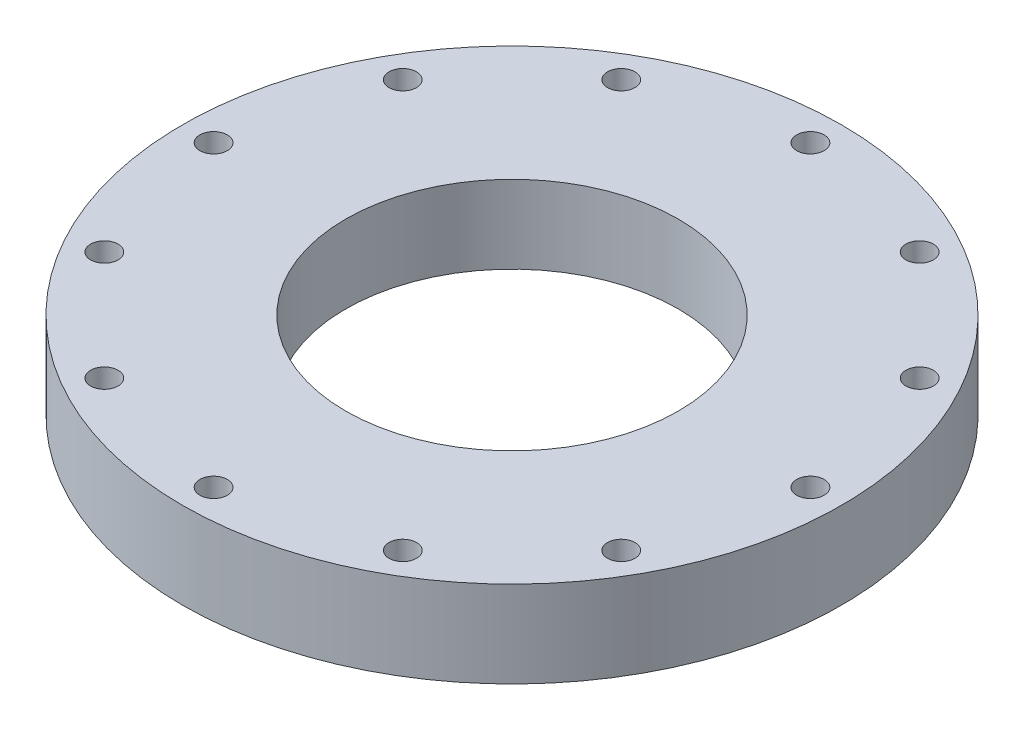
ISO-10303-21;
HEADER;
FILE_DESCRIPTION(('STEP AP214'),'2;1');
FILE_NAME('part.step','',(''),(''),'','','');
FILE_SCHEMA(('AUTOMOTIVE_DESIGN { 1 0 10303 214 1 1 1 1 }'));
ENDSEC;
DATA;
#1=APPLICATION_CONTEXT('core data for automotive mechanical design processes');
#2=APPLICATION_PROTOCOL_DEFINITION('international standard','automotive_design',2000,#1);
#3=PRODUCT_CONTEXT('',#1,'mechanical');
#4=PRODUCT('Part','Part','',(#3));
#5=PRODUCT_RELATED_PRODUCT_CATEGORY('part','',(#4));
#6=PRODUCT_DEFINITION_FORMATION('','',#4);
#7=PRODUCT_DEFINITION_CONTEXT('part definition',#1,'design');
#8=PRODUCT_DEFINITION('design','',#6,#7);
#9=PRODUCT_DEFINITION_SHAPE('','',#8);
#10=(LENGTH_UNIT() NAMED_UNIT(*) SI_UNIT(.MILLI.,.METRE.));
#11=(NAMED_UNIT(*) PLANE_ANGLE_UNIT() SI_UNIT($,.RADIAN.));
#12=(NAMED_UNIT(*) SI_UNIT($,.STERADIAN.) SOLID_ANGLE_UNIT());
#13=UNCERTAINTY_MEASURE_WITH_UNIT(LENGTH_MEASURE(1.E-05),#10,'distance_accuracy_value','');
#14=(GEOMETRIC_REPRESENTATION_CONTEXT(3) GLOBAL_UNCERTAINTY_ASSIGNED_CONTEXT((#13)) GLOBAL_UNIT_ASSIGNED_CONTEXT((#10,
#11,#12)) REPRESENTATION_CONTEXT('',''));
#15=CARTESIAN_POINT('',(0.,0.,0.));
#16=DIRECTION('',(0.,0.,1.));
#17=DIRECTION('',(1.,0.,0.));
#18=AXIS2_PLACEMENT_3D('',#15,#16,#17);
#19=CARTESIAN_POINT('',(0.,20.,0.));
#20=DIRECTION('',(0.,-1.,0.));
#21=DIRECTION('',(0.,0.,-1.));
#22=AXIS2_PLACEMENT_3D('',#19,#20,#21);
#23=CYLINDRICAL_SURFACE('',#22,38.4556);
#24=CARTESIAN_POINT('',(0.,20.,0.));
#25=DIRECTION('',(0.,1.,0.));
#26=DIRECTION('',(0.,0.,1.));
#27=AXIS2_PLACEMENT_3D('',#24,#25,#26);
#28=CIRCLE('',#27,38.4556);
#29=CARTESIAN_POINT('',(0.,20.,38.4556));
#30=VERTEX_POINT('',#29);
#31=EDGE_CURVE('E41',#30,#30,#28,.T.);
#32=ORIENTED_EDGE('',*,*,#31,.T.);
#33=EDGE_LOOP('',(#32));
#34=FACE_BOUND('',#33,.T.);
#35=CARTESIAN_POINT('',(0.,2.,0.));
#36=DIRECTION('',(0.,-1.,0.));
#37=DIRECTION('',(0.,0.,-1.));
#38=AXIS2_PLACEMENT_3D('',#35,#36,#37);
#39=CIRCLE('',#38,38.4556);
#40=CARTESIAN_POINT('',(0.,2.,-38.4556));
#41=VERTEX_POINT('',#40);
#42=EDGE_CURVE('E32',#41,#41,#39,.T.);
#43=ORIENTED_EDGE('',*,*,#42,.T.);
#44=EDGE_LOOP('',(#43));
#45=FACE_BOUND('',#44,.T.);
#46=ADVANCED_FACE('F28',(#34,#45),#23,.F.);
#47=CARTESIAN_POINT('',(0.,0.,0.));
#48=DIRECTION('',(0.,1.,0.));
#49=DIRECTION('',(0.,0.,1.));
#50=AXIS2_PLACEMENT_3D('',#47,#48,#49);
#51=PLANE('',#50);
#52=CARTESIAN_POINT('',(0.,0.,0.));
#53=DIRECTION('',(0.,-1.,0.));
#54=DIRECTION('',(0.,0.,-1.));
#55=AXIS2_PLACEMENT_3D('',#52,#53,#54);
#56=CIRCLE('',#55,55.14);
#57=CARTESIAN_POINT('',(0.,0.,-55.14));
#58=VERTEX_POINT('',#57);
#59=EDGE_CURVE('E117',#58,#58,#56,.T.);
#60=ORIENTED_EDGE('',*,*,#59,.F.);
#61=EDGE_LOOP('',(#60));
#62=FACE_BOUND('',#61,.T.);
#63=CARTESIAN_POINT('',(59.7557528611267,0.,-34.4999999999992));
#64=DIRECTION('',(0.,-1.,0.));
#65=DIRECTION('',(0.,0.,-1.));
#66=AXIS2_PLACEMENT_3D('',#63,#64,#65);
#67=CIRCLE('',#66,3.17499999999995);
#68=CARTESIAN_POINT('',(59.7557528611267,0.,-37.6749999999992));
#69=VERTEX_POINT('',#68);
#70=EDGE_CURVE('E114',#69,#69,#67,.T.);
#71=ORIENTED_EDGE('',*,*,#70,.F.);
#72=EDGE_LOOP('',(#71));
#73=FACE_BOUND('',#72,.T.);
#74=CARTESIAN_POINT('',(34.5000000000007,0.,-59.7557528611259));
#75=DIRECTION('',(0.,-1.,0.));
#76=DIRECTION('',(0.,0.,-1.));
#77=AXIS2_PLACEMENT_3D('',#74,#75,#76);
#78=CIRCLE('',#77,3.17499999999994);
#79=CARTESIAN_POINT('',(34.5000000000007,0.,-62.9307528611258));
#80=VERTEX_POINT('',#79);
#81=EDGE_CURVE('E108',#80,#80,#78,.T.);
#82=ORIENTED_EDGE('',*,*,#81,.F.);
#83=EDGE_LOOP('',(#82));
#84=FACE_BOUND('',#83,.T.);
#85=CARTESIAN_POINT('',(7.22736637140529E-13,0.,-69.));
#86=DIRECTION('',(0.,-1.,0.));
#87=DIRECTION('',(0.,0.,-1.));
#88=AXIS2_PLACEMENT_3D('',#85,#86,#87);
#89=CIRCLE('',#88,3.17499999999994);
#90=CARTESIAN_POINT('',(7.22736637140529E-13,0.,-72.175));
#91=VERTEX_POINT('',#90);
#92=EDGE_CURVE('E102',#91,#91,#89,.T.);
#93=ORIENTED_EDGE('',*,*,#92,.F.);
#94=EDGE_LOOP('',(#93));
#95=FACE_BOUND('',#94,.T.);
#96=CARTESIAN_POINT('',(-59.755752861126,0.,-34.5000000000005));
#97=DIRECTION('',(0.,-1.,0.));
#98=DIRECTION('',(0.,0.,-1.));
#99=AXIS2_PLACEMENT_3D('',#96,#97,#98);
#100=CIRCLE('',#99,3.17499999999994);
#101=CARTESIAN_POINT('',(-59.755752861126,0.,-37.6750000000004));
#102=VERTEX_POINT('',#101);
#103=EDGE_CURVE('E90',#102,#102,#100,.T.);
#104=ORIENTED_EDGE('',*,*,#103,.F.);
#105=EDGE_LOOP('',(#104));
#106=FACE_BOUND('',#105,.T.);
#107=CARTESIAN_POINT('',(-69.,0.,0.));
#108=DIRECTION('',(0.,-1.,0.));
#109=DIRECTION('',(0.,0.,-1.));
#110=AXIS2_PLACEMENT_3D('',#107,#108,#109);
#111=CIRCLE('',#110,3.17499999999994);
#112=CARTESIAN_POINT('',(-69.,0.,-3.17499999999994));
#113=VERTEX_POINT('',#112);
#114=EDGE_CURVE('E84',#113,#113,#111,.T.);
#115=ORIENTED_EDGE('',*,*,#114,.F.);
#116=EDGE_LOOP('',(#115));
#117=FACE_BOUND('',#116,.T.);
#118=CARTESIAN_POINT('',(-59.7557528611265,0.,34.4999999999997));
#119=DIRECTION('',(0.,-1.,0.));
#120=DIRECTION('',(0.,0.,-1.));
#121=AXIS2_PLACEMENT_3D('',#118,#119,#120);
#122=CIRCLE('',#121,3.17499999999994);
#123=CARTESIAN_POINT('',(-59.7557528611265,0.,31.3249999999997));
#124=VERTEX_POINT('',#123);
#125=EDGE_CURVE('E78',#124,#124,#122,.T.);
#126=ORIENTED_EDGE('',*,*,#125,.F.);
#127=EDGE_LOOP('',(#126));
#128=FACE_BOUND('',#127,.T.);
#129=CARTESIAN_POINT('',(-34.5000000000003,0.,59.7557528611261));
#130=DIRECTION('',(0.,-1.,0.));
#131=DIRECTION('',(0.,0.,-1.));
#132=AXIS2_PLACEMENT_3D('',#129,#130,#131);
#133=CIRCLE('',#132,3.17499999999994);
#134=CARTESIAN_POINT('',(-34.5000000000003,0.,56.5807528611262));
#135=VERTEX_POINT('',#134);
#136=EDGE_CURVE('E72',#135,#135,#133,.T.);
#137=ORIENTED_EDGE('',*,*,#136,.F.);
#138=EDGE_LOOP('',(#137));
#139=FACE_BOUND('',#138,.T.);
#140=CARTESIAN_POINT('',(-2.40912212380176E-13,0.,69.));
#141=DIRECTION('',(0.,-1.,0.));
#142=DIRECTION('',(0.,0.,-1.));
#143=AXIS2_PLACEMENT_3D('',#140,#141,#142);
#144=CIRCLE('',#143,3.17499999999994);
#145=CARTESIAN_POINT('',(-2.40912212380176E-13,0.,65.8250000000001));
#146=VERTEX_POINT('',#145);
#147=EDGE_CURVE('E66',#146,#146,#144,.T.);
#148=ORIENTED_EDGE('',*,*,#147,.F.);
#149=EDGE_LOOP('',(#148));
#150=FACE_BOUND('',#149,.T.);
#151=CARTESIAN_POINT('',(34.4999999999999,0.,59.7557528611264));
#152=DIRECTION('',(0.,-1.,0.));
#153=DIRECTION('',(0.,0.,-1.));
#154=AXIS2_PLACEMENT_3D('',#151,#152,#153);
#155=CIRCLE('',#154,3.17499999999994);
#156=CARTESIAN_POINT('',(34.4999999999999,0.,56.5807528611264));
#157=VERTEX_POINT('',#156);
#158=EDGE_CURVE('E60',#157,#157,#155,.T.);
#159=ORIENTED_EDGE('',*,*,#158,.F.);
#160=EDGE_LOOP('',(#159));
#161=FACE_BOUND('',#160,.T.);
#162=CARTESIAN_POINT('',(59.7557528611262,0.,34.5000000000001));
#163=DIRECTION('',(0.,-1.,0.));
#164=DIRECTION('',(0.,0.,-1.));
#165=AXIS2_PLACEMENT_3D('',#162,#163,#164);
#166=CIRCLE('',#165,3.17499999999995);
#167=CARTESIAN_POINT('',(59.7557528611262,0.,31.3250000000001));
#168=VERTEX_POINT('',#167);
#169=EDGE_CURVE('E54',#168,#168,#166,.T.);
#170=ORIENTED_EDGE('',*,*,#169,.F.);
#171=EDGE_LOOP('',(#170));
#172=FACE_BOUND('',#171,.T.);
#173=CARTESIAN_POINT('',(69.,0.,0.));
#174=DIRECTION('',(0.,-1.,0.));
#175=DIRECTION('',(0.,0.,-1.));
#176=AXIS2_PLACEMENT_3D('',#173,#174,#175);
#177=CIRCLE('',#176,3.17499999999994);
#178=CARTESIAN_POINT('',(69.,0.,-3.17499999999994));
#179=VERTEX_POINT('',#178);
#180=EDGE_CURVE('E48',#179,#179,#177,.T.);
#181=ORIENTED_EDGE('',*,*,#180,.F.);
#182=EDGE_LOOP('',(#181));
#183=FACE_BOUND('',#182,.T.);
#184=CARTESIAN_POINT('',(0.,0.,0.));
#185=DIRECTION('',(0.,1.,0.));
#186=DIRECTION('',(0.,0.,1.));
#187=AXIS2_PLACEMENT_3D('',#184,#185,#186);
#188=CIRCLE('',#187,76.2);
#189=CARTESIAN_POINT('',(0.,0.,76.2));
#190=VERTEX_POINT('',#189);
#191=EDGE_CURVE('E36',#190,#190,#188,.T.);
#192=ORIENTED_EDGE('',*,*,#191,.F.);
#193=EDGE_LOOP('',(#192));
#194=FACE_BOUND('',#193,.T.);
#195=CARTESIAN_POINT('',(-34.4999999999994,0.,-59.7557528611266));
#196=DIRECTION('',(0.,-1.,0.));
#197=DIRECTION('',(0.,0.,-1.));
#198=AXIS2_PLACEMENT_3D('',#195,#196,#197);
#199=CIRCLE('',#198,3.17499999999994);
#200=CARTESIAN_POINT('',(-34.4999999999994,0.,-62.9307528611265));
#201=VERTEX_POINT('',#200);
#202=EDGE_CURVE('E96',#201,#201,#199,.T.);
#203=ORIENTED_EDGE('',*,*,#202,.F.);
#204=EDGE_LOOP('',(#203));
#205=FACE_BOUND('',#204,.T.);
#206=ADVANCED_FACE('F139',(#62,#73,#84,#95,#106,#117,#128,#139,#150,#161,#172,#183,#194,#205),
#51,.F.);
#207=CARTESIAN_POINT('',(0.,20.,0.));
#208=DIRECTION('',(0.,1.,0.));
#209=DIRECTION('',(0.,0.,1.));
#210=AXIS2_PLACEMENT_3D('',#207,#208,#209);
#211=PLANE('',#210);
#212=CARTESIAN_POINT('',(59.7557528611267,20.,-34.4999999999992));
#213=DIRECTION('',(0.,-1.,0.));
#214=DIRECTION('',(0.,0.,-1.));
#215=AXIS2_PLACEMENT_3D('',#212,#213,#214);
#216=CIRCLE('',#215,3.17499999999995);
#217=CARTESIAN_POINT('',(59.7557528611267,20.,-37.6749999999992));
#218=VERTEX_POINT('',#217);
#219=EDGE_CURVE('E111',#218,#218,#216,.T.);
#220=ORIENTED_EDGE('',*,*,#219,.T.);
#221=EDGE_LOOP('',(#220));
#222=FACE_BOUND('',#221,.T.);
#223=CARTESIAN_POINT('',(34.5000000000007,20.,-59.7557528611259));
#224=DIRECTION('',(0.,-1.,0.));
#225=DIRECTION('',(0.,0.,-1.));
#226=AXIS2_PLACEMENT_3D('',#223,#224,#225);
#227=CIRCLE('',#226,3.17499999999994);
#228=CARTESIAN_POINT('',(34.5000000000007,20.,-62.9307528611258));
#229=VERTEX_POINT('',#228);
#230=EDGE_CURVE('E105',#229,#229,#227,.T.);
#231=ORIENTED_EDGE('',*,*,#230,.T.);
#232=EDGE_LOOP('',(#231));
#233=FACE_BOUND('',#232,.T.);
#234=CARTESIAN_POINT('',(7.22736637140529E-13,20.,-69.));
#235=DIRECTION('',(0.,-1.,0.));
#236=DIRECTION('',(0.,0.,-1.));
#237=AXIS2_PLACEMENT_3D('',#234,#235,#236);
#238=CIRCLE('',#237,3.17499999999994);
#239=CARTESIAN_POINT('',(7.22736637140529E-13,20.,-72.175));
#240=VERTEX_POINT('',#239);
#241=EDGE_CURVE('E99',#240,#240,#238,.T.);
#242=ORIENTED_EDGE('',*,*,#241,.T.);
#243=EDGE_LOOP('',(#242));
#244=FACE_BOUND('',#243,.T.);
#245=CARTESIAN_POINT('',(-59.7557528611265,20.,34.4999999999997));
#246=DIRECTION('',(0.,-1.,0.));
#247=DIRECTION('',(0.,0.,-1.));
#248=AXIS2_PLACEMENT_3D('',#245,#246,#247);
#249=CIRCLE('',#248,3.17499999999994);
#250=CARTESIAN_POINT('',(-59.7557528611265,20.,31.3249999999997));
#251=VERTEX_POINT('',#250);
#252=EDGE_CURVE('E75',#251,#251,#249,.T.);
#253=ORIENTED_EDGE('',*,*,#252,.T.);
#254=EDGE_LOOP('',(#253));
#255=FACE_BOUND('',#254,.T.);
#256=CARTESIAN_POINT('',(-34.5000000000003,20.,59.7557528611261));
#257=DIRECTION('',(0.,-1.,0.));
#258=DIRECTION('',(0.,0.,-1.));
#259=AXIS2_PLACEMENT_3D('',#256,#257,#258);
#260=CIRCLE('',#259,3.17499999999994);
#261=CARTESIAN_POINT('',(-34.5000000000003,20.,56.5807528611262));
#262=VERTEX_POINT('',#261);
#263=EDGE_CURVE('E69',#262,#262,#260,.T.);
#264=ORIENTED_EDGE('',*,*,#263,.T.);
#265=EDGE_LOOP('',(#264));
#266=FACE_BOUND('',#265,.T.);
#267=CARTESIAN_POINT('',(-2.40912212380176E-13,20.,69.));
#268=DIRECTION('',(0.,-1.,0.));
#269=DIRECTION('',(0.,0.,-1.));
#270=AXIS2_PLACEMENT_3D('',#267,#268,#269);
#271=CIRCLE('',#270,3.17499999999994);
#272=CARTESIAN_POINT('',(-2.40912212380176E-13,20.,65.8250000000001));
#273=VERTEX_POINT('',#272);
#274=EDGE_CURVE('E63',#273,#273,#271,.T.);
#275=ORIENTED_EDGE('',*,*,#274,.T.);
#276=EDGE_LOOP('',(#275));
#277=FACE_BOUND('',#276,.T.);
#278=CARTESIAN_POINT('',(34.4999999999999,20.,59.7557528611264));
#279=DIRECTION('',(0.,-1.,0.));
#280=DIRECTION('',(0.,0.,-1.));
#281=AXIS2_PLACEMENT_3D('',#278,#279,#280);
#282=CIRCLE('',#281,3.17499999999994);
#283=CARTESIAN_POINT('',(34.4999999999999,20.,56.5807528611264));
#284=VERTEX_POINT('',#283);
#285=EDGE_CURVE('E57',#284,#284,#282,.T.);
#286=ORIENTED_EDGE('',*,*,#285,.T.);
#287=EDGE_LOOP('',(#286));
#288=FACE_BOUND('',#287,.T.);
#289=CARTESIAN_POINT('',(59.7557528611262,20.,34.5000000000001));
#290=DIRECTION('',(0.,-1.,0.));
#291=DIRECTION('',(0.,0.,-1.));
#292=AXIS2_PLACEMENT_3D('',#289,#290,#291);
#293=CIRCLE('',#292,3.17499999999995);
#294=CARTESIAN_POINT('',(59.7557528611262,20.,31.3250000000001));
#295=VERTEX_POINT('',#294);
#296=EDGE_CURVE('E51',#295,#295,#293,.T.);
#297=ORIENTED_EDGE('',*,*,#296,.T.);
#298=EDGE_LOOP('',(#297));
#299=FACE_BOUND('',#298,.T.);
#300=CARTESIAN_POINT('',(69.,20.,0.));
#301=DIRECTION('',(0.,1.,0.));
#302=DIRECTION('',(0.,0.,1.));
#303=AXIS2_PLACEMENT_3D('',#300,#301,#302);
#304=CIRCLE('',#303,3.17499999999991);
#305=CARTESIAN_POINT('',(69.,20.,3.17499999999991));
#306=VERTEX_POINT('',#305);
#307=EDGE_CURVE('E45',#306,#306,#304,.T.);
#308=ORIENTED_EDGE('',*,*,#307,.F.);
#309=EDGE_LOOP('',(#308));
#310=FACE_BOUND('',#309,.T.);
#311=CARTESIAN_POINT('',(0.,20.,0.));
#312=DIRECTION('',(0.,1.,0.));
#313=DIRECTION('',(0.,0.,1.));
#314=AXIS2_PLACEMENT_3D('',#311,#312,#313);
#315=CIRCLE('',#314,76.2);
#316=CARTESIAN_POINT('',(0.,20.,76.2));
#317=VERTEX_POINT('',#316);
#318=EDGE_CURVE('E10',#317,#317,#315,.T.);
#319=ORIENTED_EDGE('',*,*,#318,.T.);
#320=EDGE_LOOP('',(#319));
#321=FACE_BOUND('',#320,.T.);
#322=ORIENTED_EDGE('',*,*,#31,.F.);
#323=EDGE_LOOP('',(#322));
#324=FACE_BOUND('',#323,.T.);
#325=CARTESIAN_POINT('',(-69.,20.,0.));
#326=DIRECTION('',(0.,-1.,0.));
#327=DIRECTION('',(0.,0.,-1.));
#328=AXIS2_PLACEMENT_3D('',#325,#326,#327);
#329=CIRCLE('',#328,3.17499999999994);
#330=CARTESIAN_POINT('',(-69.,20.,-3.17499999999994));
#331=VERTEX_POINT('',#330);
#332=EDGE_CURVE('E81',#331,#331,#329,.T.);
#333=ORIENTED_EDGE('',*,*,#332,.T.);
#334=EDGE_LOOP('',(#333));
#335=FACE_BOUND('',#334,.T.);
#336=CARTESIAN_POINT('',(-59.755752861126,20.,-34.5000000000005));
#337=DIRECTION('',(0.,-1.,0.));
#338=DIRECTION('',(0.,0.,-1.));
#339=AXIS2_PLACEMENT_3D('',#336,#337,#338);
#340=CIRCLE('',#339,3.17499999999994);
#341=CARTESIAN_POINT('',(-59.755752861126,20.,-37.6750000000004));
#342=VERTEX_POINT('',#341);
#343=EDGE_CURVE('E87',#342,#342,#340,.T.);
#344=ORIENTED_EDGE('',*,*,#343,.T.);
#345=EDGE_LOOP('',(#344));
#346=FACE_BOUND('',#345,.T.);
#347=CARTESIAN_POINT('',(-34.4999999999994,20.,-59.7557528611266));
#348=DIRECTION('',(0.,-1.,0.));
#349=DIRECTION('',(0.,0.,-1.));
#350=AXIS2_PLACEMENT_3D('',#347,#348,#349);
#351=CIRCLE('',#350,3.17499999999994);
#352=CARTESIAN_POINT('',(-34.4999999999994,20.,-62.9307528611265));
#353=VERTEX_POINT('',#352);
#354=EDGE_CURVE('E93',#353,#353,#351,.T.);
#355=ORIENTED_EDGE('',*,*,#354,.T.);
#356=EDGE_LOOP('',(#355));
#357=FACE_BOUND('',#356,.T.);
#358=ADVANCED_FACE('F145',(#222,#233,#244,#255,#266,#277,#288,#299,#310,#321,#324,#335,#346,
#357),#211,.T.);
#359=CARTESIAN_POINT('',(0.,20.,0.));
#360=DIRECTION('',(0.,-1.,0.));
#361=DIRECTION('',(0.,0.,-1.));
#362=AXIS2_PLACEMENT_3D('',#359,#360,#361);
#363=CYLINDRICAL_SURFACE('',#362,76.2);
#364=ORIENTED_EDGE('',*,*,#318,.F.);
#365=EDGE_LOOP('',(#364));
#366=FACE_BOUND('',#365,.T.);
#367=ORIENTED_EDGE('',*,*,#191,.T.);
#368=EDGE_LOOP('',(#367));
#369=FACE_BOUND('',#368,.T.);
#370=ADVANCED_FACE('F30',(#366,#369),#363,.T.);
#371=CARTESIAN_POINT('',(69.,0.,0.));
#372=DIRECTION('',(0.,-1.,0.));
#373=DIRECTION('',(0.,0.,-1.));
#374=AXIS2_PLACEMENT_3D('',#371,#372,#373);
#375=CYLINDRICAL_SURFACE('',#374,3.17499999999991);
#376=ORIENTED_EDGE('',*,*,#307,.T.);
#377=EDGE_LOOP('',(#376));
#378=FACE_BOUND('',#377,.T.);
#379=ORIENTED_EDGE('',*,*,#180,.T.);
#380=EDGE_LOOP('',(#379));
#381=FACE_BOUND('',#380,.T.);
#382=ADVANCED_FACE('F149',(#378,#381),#375,.F.);
#383=CARTESIAN_POINT('',(59.7557528611262,0.,34.5000000000001));
#384=DIRECTION('',(0.,-1.,0.));
#385=DIRECTION('',(0.,0.,-1.));
#386=AXIS2_PLACEMENT_3D('',#383,#384,#385);
#387=CYLINDRICAL_SURFACE('',#386,3.17499999999995);
#388=ORIENTED_EDGE('',*,*,#296,.F.);
#389=EDGE_LOOP('',(#388));
#390=FACE_BOUND('',#389,.T.);
#391=ORIENTED_EDGE('',*,*,#169,.T.);
#392=EDGE_LOOP('',(#391));
#393=FACE_BOUND('',#392,.T.);
#394=ADVANCED_FACE('F220',(#390,#393),#387,.F.);
#395=CARTESIAN_POINT('',(34.4999999999999,0.,59.7557528611264));
#396=DIRECTION('',(0.,-1.,0.));
#397=DIRECTION('',(0.,0.,-1.));
#398=AXIS2_PLACEMENT_3D('',#395,#396,#397);
#399=CYLINDRICAL_SURFACE('',#398,3.17499999999994);
#400=ORIENTED_EDGE('',*,*,#285,.F.);
#401=EDGE_LOOP('',(#400));
#402=FACE_BOUND('',#401,.T.);
#403=ORIENTED_EDGE('',*,*,#158,.T.);
#404=EDGE_LOOP('',(#403));
#405=FACE_BOUND('',#404,.T.);
#406=ADVANCED_FACE('F217',(#402,#405),#399,.F.);
#407=CARTESIAN_POINT('',(-2.40912212380176E-13,0.,69.));
#408=DIRECTION('',(0.,-1.,0.));
#409=DIRECTION('',(0.,0.,-1.));
#410=AXIS2_PLACEMENT_3D('',#407,#408,#409);
#411=CYLINDRICAL_SURFACE('',#410,3.17499999999994);
#412=ORIENTED_EDGE('',*,*,#274,.F.);
#413=EDGE_LOOP('',(#412));
#414=FACE_BOUND('',#413,.T.);
#415=ORIENTED_EDGE('',*,*,#147,.T.);
#416=EDGE_LOOP('',(#415));
#417=FACE_BOUND('',#416,.T.);
#418=ADVANCED_FACE('F213',(#414,#417),#411,.F.);
#419=CARTESIAN_POINT('',(-34.5000000000003,0.,59.7557528611261));
#420=DIRECTION('',(0.,-1.,0.));
#421=DIRECTION('',(0.,0.,-1.));
#422=AXIS2_PLACEMENT_3D('',#419,#420,#421);
#423=CYLINDRICAL_SURFACE('',#422,3.17499999999994);
#424=ORIENTED_EDGE('',*,*,#263,.F.);
#425=EDGE_LOOP('',(#424));
#426=FACE_BOUND('',#425,.T.);
#427=ORIENTED_EDGE('',*,*,#136,.T.);
#428=EDGE_LOOP('',(#427));
#429=FACE_BOUND('',#428,.T.);
#430=ADVANCED_FACE('F209',(#426,#429),#423,.F.);
#431=CARTESIAN_POINT('',(-59.7557528611265,0.,34.4999999999997));
#432=DIRECTION('',(0.,-1.,0.));
#433=DIRECTION('',(0.,0.,-1.));
#434=AXIS2_PLACEMENT_3D('',#431,#432,#433);
#435=CYLINDRICAL_SURFACE('',#434,3.17499999999994);
#436=ORIENTED_EDGE('',*,*,#252,.F.);
#437=EDGE_LOOP('',(#436));
#438=FACE_BOUND('',#437,.T.);
#439=ORIENTED_EDGE('',*,*,#125,.T.);
#440=EDGE_LOOP('',(#439));
#441=FACE_BOUND('',#440,.T.);
#442=ADVANCED_FACE('F205',(#438,#441),#435,.F.);
#443=CARTESIAN_POINT('',(-69.,0.,0.));
#444=DIRECTION('',(0.,-1.,0.));
#445=DIRECTION('',(0.,0.,-1.));
#446=AXIS2_PLACEMENT_3D('',#443,#444,#445);
#447=CYLINDRICAL_SURFACE('',#446,3.17499999999994);
#448=ORIENTED_EDGE('',*,*,#332,.F.);
#449=EDGE_LOOP('',(#448));
#450=FACE_BOUND('',#449,.T.);
#451=ORIENTED_EDGE('',*,*,#114,.T.);
#452=EDGE_LOOP('',(#451));
#453=FACE_BOUND('',#452,.T.);
#454=ADVANCED_FACE('F198',(#450,#453),#447,.F.);
#455=CARTESIAN_POINT('',(-59.755752861126,0.,-34.5000000000005));
#456=DIRECTION('',(0.,-1.,0.));
#457=DIRECTION('',(0.,0.,-1.));
#458=AXIS2_PLACEMENT_3D('',#455,#456,#457);
#459=CYLINDRICAL_SURFACE('',#458,3.17499999999994);
#460=ORIENTED_EDGE('',*,*,#343,.F.);
#461=EDGE_LOOP('',(#460));
#462=FACE_BOUND('',#461,.T.);
#463=ORIENTED_EDGE('',*,*,#103,.T.);
#464=EDGE_LOOP('',(#463));
#465=FACE_BOUND('',#464,.T.);
#466=ADVANCED_FACE('F187',(#462,#465),#459,.F.);
#467=CARTESIAN_POINT('',(-34.4999999999994,0.,-59.7557528611266));
#468=DIRECTION('',(0.,-1.,0.));
#469=DIRECTION('',(0.,0.,-1.));
#470=AXIS2_PLACEMENT_3D('',#467,#468,#469);
#471=CYLINDRICAL_SURFACE('',#470,3.17499999999994);
#472=ORIENTED_EDGE('',*,*,#354,.F.);
#473=EDGE_LOOP('',(#472));
#474=FACE_BOUND('',#473,.T.);
#475=ORIENTED_EDGE('',*,*,#202,.T.);
#476=EDGE_LOOP('',(#475));
#477=FACE_BOUND('',#476,.T.);
#478=ADVANCED_FACE('F183',(#474,#477),#471,.F.);
#479=CARTESIAN_POINT('',(7.22736637140529E-13,0.,-69.));
#480=DIRECTION('',(0.,-1.,0.));
#481=DIRECTION('',(0.,0.,-1.));
#482=AXIS2_PLACEMENT_3D('',#479,#480,#481);
#483=CYLINDRICAL_SURFACE('',#482,3.17499999999994);
#484=ORIENTED_EDGE('',*,*,#241,.F.);
#485=EDGE_LOOP('',(#484));
#486=FACE_BOUND('',#485,.T.);
#487=ORIENTED_EDGE('',*,*,#92,.T.);
#488=EDGE_LOOP('',(#487));
#489=FACE_BOUND('',#488,.T.);
#490=ADVANCED_FACE('F186',(#486,#489),#483,.F.);
#491=CARTESIAN_POINT('',(34.5000000000007,0.,-59.7557528611259));
#492=DIRECTION('',(0.,-1.,0.));
#493=DIRECTION('',(0.,0.,-1.));
#494=AXIS2_PLACEMENT_3D('',#491,#492,#493);
#495=CYLINDRICAL_SURFACE('',#494,3.17499999999994);
#496=ORIENTED_EDGE('',*,*,#230,.F.);
#497=EDGE_LOOP('',(#496));
#498=FACE_BOUND('',#497,.T.);
#499=ORIENTED_EDGE('',*,*,#81,.T.);
#500=EDGE_LOOP('',(#499));
#501=FACE_BOUND('',#500,.T.);
#502=ADVANCED_FACE('F195',(#498,#501),#495,.F.);
#503=CARTESIAN_POINT('',(59.7557528611267,0.,-34.4999999999992));
#504=DIRECTION('',(0.,-1.,0.));
#505=DIRECTION('',(0.,0.,-1.));
#506=AXIS2_PLACEMENT_3D('',#503,#504,#505);
#507=CYLINDRICAL_SURFACE('',#506,3.17499999999995);
#508=ORIENTED_EDGE('',*,*,#219,.F.);
#509=EDGE_LOOP('',(#508));
#510=FACE_BOUND('',#509,.T.);
#511=ORIENTED_EDGE('',*,*,#70,.T.);
#512=EDGE_LOOP('',(#511));
#513=FACE_BOUND('',#512,.T.);
#514=ADVANCED_FACE('F135',(#510,#513),#507,.F.);
#515=CARTESIAN_POINT('',(0.,2.,0.));
#516=DIRECTION('',(0.,-1.,0.));
#517=DIRECTION('',(0.,0.,-1.));
#518=AXIS2_PLACEMENT_3D('',#515,#516,#517);
#519=CYLINDRICAL_SURFACE('',#518,55.14);
#520=CARTESIAN_POINT('',(0.,2.,0.));
#521=DIRECTION('',(0.,-1.,0.));
#522=DIRECTION('',(0.,0.,-1.));
#523=AXIS2_PLACEMENT_3D('',#520,#521,#522);
#524=CIRCLE('',#523,55.14);
#525=CARTESIAN_POINT('',(0.,2.,-55.14));
#526=VERTEX_POINT('',#525);
#527=EDGE_CURVE('E120',#526,#526,#524,.T.);
#528=ORIENTED_EDGE('',*,*,#527,.F.);
#529=EDGE_LOOP('',(#528));
#530=FACE_BOUND('',#529,.T.);
#531=ORIENTED_EDGE('',*,*,#59,.T.);
#532=EDGE_LOOP('',(#531));
#533=FACE_BOUND('',#532,.T.);
#534=ADVANCED_FACE('F130',(#530,#533),#519,.F.);
#535=CARTESIAN_POINT('',(0.,2.,0.));
#536=DIRECTION('',(0.,-1.,0.));
#537=DIRECTION('',(0.,0.,-1.));
#538=AXIS2_PLACEMENT_3D('',#535,#536,#537);
#539=PLANE('',#538);
#540=ORIENTED_EDGE('',*,*,#42,.F.);
#541=EDGE_LOOP('',(#540));
#542=FACE_BOUND('',#541,.T.);
#543=ORIENTED_EDGE('',*,*,#527,.T.);
#544=EDGE_LOOP('',(#543));
#545=FACE_BOUND('',#544,.T.);
#546=ADVANCED_FACE('F128',(#542,#545),#539,.T.);
#547=CLOSED_SHELL('',(#46,#206,#358,#370,#382,#394,#406,#418,#430,#442,#454,#466,#478,#490,#502,
#514,#534,#546));
#548=MANIFOLD_SOLID_BREP('B2',#547);
#549=ADVANCED_BREP_SHAPE_REPRESENTATION('',(#18,#548),#14);
#550=SHAPE_DEFINITION_REPRESENTATION(#9,#549);
ENDSEC;
END-ISO-10303-21;
